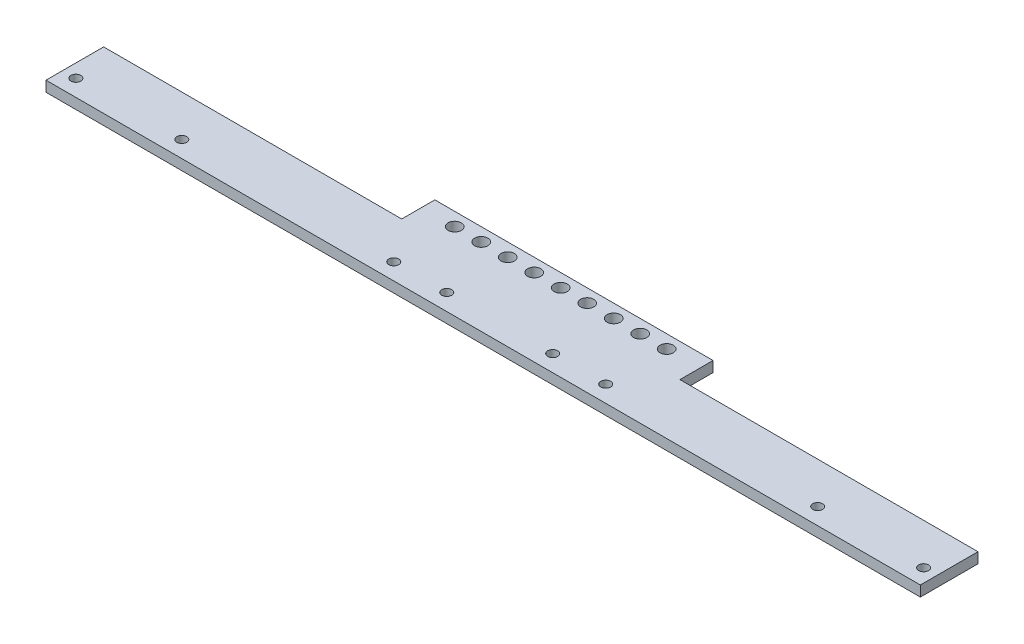
ISO-10303-21;
HEADER;
FILE_DESCRIPTION(('STEP AP214'),'2;1');
FILE_NAME('part.step','',(''),(''),'','','');
FILE_SCHEMA(('AUTOMOTIVE_DESIGN { 1 0 10303 214 1 1 1 1 }'));
ENDSEC;
DATA;
#1=APPLICATION_CONTEXT('core data for automotive mechanical design processes');
#2=APPLICATION_PROTOCOL_DEFINITION('international standard','automotive_design',2000,#1);
#3=PRODUCT_CONTEXT('',#1,'mechanical');
#4=PRODUCT('Part','Part','',(#3));
#5=PRODUCT_RELATED_PRODUCT_CATEGORY('part','',(#4));
#6=PRODUCT_DEFINITION_FORMATION('','',#4);
#7=PRODUCT_DEFINITION_CONTEXT('part definition',#1,'design');
#8=PRODUCT_DEFINITION('design','',#6,#7);
#9=PRODUCT_DEFINITION_SHAPE('','',#8);
#10=(LENGTH_UNIT() NAMED_UNIT(*) SI_UNIT(.MILLI.,.METRE.));
#11=(NAMED_UNIT(*) PLANE_ANGLE_UNIT() SI_UNIT($,.RADIAN.));
#12=(NAMED_UNIT(*) SI_UNIT($,.STERADIAN.) SOLID_ANGLE_UNIT());
#13=UNCERTAINTY_MEASURE_WITH_UNIT(LENGTH_MEASURE(1.E-05),#10,'distance_accuracy_value','');
#14=(GEOMETRIC_REPRESENTATION_CONTEXT(3) GLOBAL_UNCERTAINTY_ASSIGNED_CONTEXT((#13)) GLOBAL_UNIT_ASSIGNED_CONTEXT((#10,
#11,#12)) REPRESENTATION_CONTEXT('',''));
#15=CARTESIAN_POINT('',(0.,0.,0.));
#16=DIRECTION('',(0.,0.,1.));
#17=DIRECTION('',(1.,0.,0.));
#18=AXIS2_PLACEMENT_3D('',#15,#16,#17);
#19=CARTESIAN_POINT('',(264.,3.175,0.));
#20=DIRECTION('',(-1.,0.,0.));
#21=DIRECTION('',(0.,0.,1.));
#22=AXIS2_PLACEMENT_3D('',#19,#20,#21);
#23=PLANE('',#22);
#24=DIRECTION('',(0.,1.,0.));
#25=VECTOR('',#24,1.);
#26=CARTESIAN_POINT('',(264.,-6.825,-15.5356341426765));
#27=LINE('',#26,#25);
#28=CARTESIAN_POINT('',(264.,0.,-15.5356341426765));
#29=VERTEX_POINT('',#28);
#30=CARTESIAN_POINT('',(264.,3.175,-15.5356341426765));
#31=VERTEX_POINT('',#30);
#32=EDGE_CURVE('E156',#29,#31,#27,.T.);
#33=ORIENTED_EDGE('',*,*,#32,.T.);
#34=DIRECTION('',(0.,0.,-1.));
#35=VECTOR('',#34,1.);
#36=CARTESIAN_POINT('',(264.,3.175,0.));
#37=LINE('',#36,#35);
#38=CARTESIAN_POINT('',(264.,3.175,1.86996477732341));
#39=VERTEX_POINT('',#38);
#40=EDGE_CURVE('E170',#39,#31,#37,.T.);
#41=ORIENTED_EDGE('',*,*,#40,.F.);
#42=DIRECTION('',(0.,-1.,0.));
#43=VECTOR('',#42,1.);
#44=CARTESIAN_POINT('',(264.,3.175,1.86996477732341));
#45=LINE('',#44,#43);
#46=CARTESIAN_POINT('',(264.,0.,1.86996477732341));
#47=VERTEX_POINT('',#46);
#48=EDGE_CURVE('E12',#39,#47,#45,.T.);
#49=ORIENTED_EDGE('',*,*,#48,.T.);
#50=DIRECTION('',(0.,0.,-1.));
#51=VECTOR('',#50,1.);
#52=CARTESIAN_POINT('',(264.,0.,0.));
#53=LINE('',#52,#51);
#54=EDGE_CURVE('E203',#47,#29,#53,.T.);
#55=ORIENTED_EDGE('',*,*,#54,.T.);
#56=EDGE_LOOP('',(#33,#41,#49,#55));
#57=FACE_BOUND('',#56,.T.);
#58=ADVANCED_FACE('F80',(#57),#23,.F.);
#59=CARTESIAN_POINT('',(0.,3.175,-25.5356341426765));
#60=DIRECTION('',(0.,0.,-1.));
#61=DIRECTION('',(-1.,0.,0.));
#62=AXIS2_PLACEMENT_3D('',#59,#60,#61);
#63=PLANE('',#62);
#64=DIRECTION('',(1.,0.,0.));
#65=VECTOR('',#64,1.);
#66=CARTESIAN_POINT('',(0.,0.,-25.5356341426765));
#67=LINE('',#66,#65);
#68=CARTESIAN_POINT('',(90.,0.,-25.5356341426765));
#69=VERTEX_POINT('',#68);
#70=CARTESIAN_POINT('',(174.,0.,-25.5356341426765));
#71=VERTEX_POINT('',#70);
#72=EDGE_CURVE('E164',#69,#71,#67,.T.);
#73=ORIENTED_EDGE('',*,*,#72,.F.);
#74=DIRECTION('',(0.,1.,0.));
#75=VECTOR('',#74,1.);
#76=CARTESIAN_POINT('',(90.,-6.825,-25.5356341426765));
#77=LINE('',#76,#75);
#78=CARTESIAN_POINT('',(90.,3.175,-25.5356341426765));
#79=VERTEX_POINT('',#78);
#80=EDGE_CURVE('E149',#69,#79,#77,.T.);
#81=ORIENTED_EDGE('',*,*,#80,.T.);
#82=DIRECTION('',(1.,0.,0.));
#83=VECTOR('',#82,1.);
#84=CARTESIAN_POINT('',(0.,3.175,-25.5356341426765));
#85=LINE('',#84,#83);
#86=CARTESIAN_POINT('',(174.,3.175,-25.5356341426765));
#87=VERTEX_POINT('',#86);
#88=EDGE_CURVE('E162',#79,#87,#85,.T.);
#89=ORIENTED_EDGE('',*,*,#88,.T.);
#90=DIRECTION('',(0.,1.,0.));
#91=VECTOR('',#90,1.);
#92=CARTESIAN_POINT('',(174.,-6.825,-25.5356341426765));
#93=LINE('',#92,#91);
#94=EDGE_CURVE('E103',#71,#87,#93,.T.);
#95=ORIENTED_EDGE('',*,*,#94,.F.);
#96=EDGE_LOOP('',(#73,#81,#89,#95));
#97=FACE_BOUND('',#96,.T.);
#98=ADVANCED_FACE('F161',(#97),#63,.T.);
#99=CARTESIAN_POINT('',(0.,0.,0.));
#100=DIRECTION('',(0.,1.,0.));
#101=DIRECTION('',(0.,0.,1.));
#102=AXIS2_PLACEMENT_3D('',#99,#100,#101);
#103=PLANE('',#102);
#104=CARTESIAN_POINT('',(108.,0.,-21.5356341426765));
#105=DIRECTION('',(0.,1.,0.));
#106=DIRECTION('',(0.,0.,1.));
#107=AXIS2_PLACEMENT_3D('',#104,#105,#106);
#108=CIRCLE('',#107,2.);
#109=CARTESIAN_POINT('',(108.,0.,-19.5356341426765));
#110=VERTEX_POINT('',#109);
#111=EDGE_CURVE('E285',#110,#110,#108,.T.);
#112=ORIENTED_EDGE('',*,*,#111,.T.);
#113=EDGE_LOOP('',(#112));
#114=FACE_BOUND('',#113,.T.);
#115=CARTESIAN_POINT('',(116.,0.,-21.5356341426765));
#116=DIRECTION('',(0.,1.,0.));
#117=DIRECTION('',(0.,0.,1.));
#118=AXIS2_PLACEMENT_3D('',#115,#116,#117);
#119=CIRCLE('',#118,2.);
#120=CARTESIAN_POINT('',(116.,0.,-19.5356341426765));
#121=VERTEX_POINT('',#120);
#122=EDGE_CURVE('E292',#121,#121,#119,.T.);
#123=ORIENTED_EDGE('',*,*,#122,.T.);
#124=EDGE_LOOP('',(#123));
#125=FACE_BOUND('',#124,.T.);
#126=CARTESIAN_POINT('',(124.,0.,-21.5356341426765));
#127=DIRECTION('',(0.,1.,0.));
#128=DIRECTION('',(0.,0.,1.));
#129=AXIS2_PLACEMENT_3D('',#126,#127,#128);
#130=CIRCLE('',#129,2.);
#131=CARTESIAN_POINT('',(124.,0.,-19.5356341426765));
#132=VERTEX_POINT('',#131);
#133=EDGE_CURVE('E295',#132,#132,#130,.T.);
#134=ORIENTED_EDGE('',*,*,#133,.T.);
#135=EDGE_LOOP('',(#134));
#136=FACE_BOUND('',#135,.T.);
#137=CARTESIAN_POINT('',(140.,0.,-21.5356341426765));
#138=DIRECTION('',(0.,1.,0.));
#139=DIRECTION('',(0.,0.,1.));
#140=AXIS2_PLACEMENT_3D('',#137,#138,#139);
#141=CIRCLE('',#140,2.);
#142=CARTESIAN_POINT('',(140.,0.,-19.5356341426765));
#143=VERTEX_POINT('',#142);
#144=EDGE_CURVE('E298',#143,#143,#141,.T.);
#145=ORIENTED_EDGE('',*,*,#144,.T.);
#146=EDGE_LOOP('',(#145));
#147=FACE_BOUND('',#146,.T.);
#148=CARTESIAN_POINT('',(148.,0.,-21.5356341426765));
#149=DIRECTION('',(0.,1.,0.));
#150=DIRECTION('',(0.,0.,1.));
#151=AXIS2_PLACEMENT_3D('',#148,#149,#150);
#152=CIRCLE('',#151,2.);
#153=CARTESIAN_POINT('',(148.,0.,-19.5356341426765));
#154=VERTEX_POINT('',#153);
#155=EDGE_CURVE('E301',#154,#154,#152,.T.);
#156=ORIENTED_EDGE('',*,*,#155,.T.);
#157=EDGE_LOOP('',(#156));
#158=FACE_BOUND('',#157,.T.);
#159=CARTESIAN_POINT('',(156.,0.,-21.5356341426765));
#160=DIRECTION('',(0.,1.,0.));
#161=DIRECTION('',(0.,0.,1.));
#162=AXIS2_PLACEMENT_3D('',#159,#160,#161);
#163=CIRCLE('',#162,2.);
#164=CARTESIAN_POINT('',(156.,0.,-19.5356341426765));
#165=VERTEX_POINT('',#164);
#166=EDGE_CURVE('E304',#165,#165,#163,.T.);
#167=ORIENTED_EDGE('',*,*,#166,.T.);
#168=EDGE_LOOP('',(#167));
#169=FACE_BOUND('',#168,.T.);
#170=CARTESIAN_POINT('',(100.,0.,-3.13003522267659));
#171=DIRECTION('',(0.,1.,0.));
#172=DIRECTION('',(0.,0.,1.));
#173=AXIS2_PLACEMENT_3D('',#170,#171,#172);
#174=CIRCLE('',#173,1.5);
#175=CARTESIAN_POINT('',(100.,0.,-1.63003522267659));
#176=VERTEX_POINT('',#175);
#177=EDGE_CURVE('E194',#176,#176,#174,.T.);
#178=ORIENTED_EDGE('',*,*,#177,.T.);
#179=EDGE_LOOP('',(#178));
#180=FACE_BOUND('',#179,.T.);
#181=CARTESIAN_POINT('',(116.,0.,-3.13003522267659));
#182=DIRECTION('',(0.,1.,0.));
#183=DIRECTION('',(0.,0.,1.));
#184=AXIS2_PLACEMENT_3D('',#181,#182,#183);
#185=CIRCLE('',#184,1.5);
#186=CARTESIAN_POINT('',(116.,0.,-1.63003522267659));
#187=VERTEX_POINT('',#186);
#188=EDGE_CURVE('E251',#187,#187,#185,.T.);
#189=ORIENTED_EDGE('',*,*,#188,.T.);
#190=EDGE_LOOP('',(#189));
#191=FACE_BOUND('',#190,.T.);
#192=CARTESIAN_POINT('',(148.,0.,-3.13003522267659));
#193=DIRECTION('',(0.,1.,0.));
#194=DIRECTION('',(0.,0.,1.));
#195=AXIS2_PLACEMENT_3D('',#192,#193,#194);
#196=CIRCLE('',#195,1.5);
#197=CARTESIAN_POINT('',(148.,0.,-1.63003522267659));
#198=VERTEX_POINT('',#197);
#199=EDGE_CURVE('E254',#198,#198,#196,.T.);
#200=ORIENTED_EDGE('',*,*,#199,.T.);
#201=EDGE_LOOP('',(#200));
#202=FACE_BOUND('',#201,.T.);
#203=CARTESIAN_POINT('',(164.,0.,-3.13003522267659));
#204=DIRECTION('',(0.,1.,0.));
#205=DIRECTION('',(0.,0.,1.));
#206=AXIS2_PLACEMENT_3D('',#203,#204,#205);
#207=CIRCLE('',#206,1.5);
#208=CARTESIAN_POINT('',(164.,0.,-1.63003522267659));
#209=VERTEX_POINT('',#208);
#210=EDGE_CURVE('E257',#209,#209,#207,.T.);
#211=ORIENTED_EDGE('',*,*,#210,.T.);
#212=EDGE_LOOP('',(#211));
#213=FACE_BOUND('',#212,.T.);
#214=CARTESIAN_POINT('',(132.,0.,-21.5356341426765));
#215=DIRECTION('',(0.,1.,0.));
#216=DIRECTION('',(0.,0.,1.));
#217=AXIS2_PLACEMENT_3D('',#214,#215,#216);
#218=CIRCLE('',#217,2.);
#219=CARTESIAN_POINT('',(132.,0.,-19.5356341426765));
#220=VERTEX_POINT('',#219);
#221=EDGE_CURVE('E190',#220,#220,#218,.T.);
#222=ORIENTED_EDGE('',*,*,#221,.T.);
#223=EDGE_LOOP('',(#222));
#224=FACE_BOUND('',#223,.T.);
#225=CARTESIAN_POINT('',(100.,0.,-21.5356341426765));
#226=DIRECTION('',(0.,1.,0.));
#227=DIRECTION('',(0.,0.,1.));
#228=AXIS2_PLACEMENT_3D('',#225,#226,#227);
#229=CIRCLE('',#228,2.);
#230=CARTESIAN_POINT('',(100.,0.,-19.5356341426765));
#231=VERTEX_POINT('',#230);
#232=EDGE_CURVE('E193',#231,#231,#229,.F.);
#233=ORIENTED_EDGE('',*,*,#232,.F.);
#234=EDGE_LOOP('',(#233));
#235=FACE_BOUND('',#234,.T.);
#236=CARTESIAN_POINT('',(164.,0.,-21.5356341426765));
#237=DIRECTION('',(0.,1.,0.));
#238=DIRECTION('',(0.,0.,1.));
#239=AXIS2_PLACEMENT_3D('',#236,#237,#238);
#240=CIRCLE('',#239,2.);
#241=CARTESIAN_POINT('',(164.,0.,-19.5356341426765));
#242=VERTEX_POINT('',#241);
#243=EDGE_CURVE('E197',#242,#242,#240,.T.);
#244=ORIENTED_EDGE('',*,*,#243,.T.);
#245=EDGE_LOOP('',(#244));
#246=FACE_BOUND('',#245,.T.);
#247=CARTESIAN_POINT('',(36.,0.,-3.13003522267659));
#248=DIRECTION('',(0.,1.,0.));
#249=DIRECTION('',(0.,0.,1.));
#250=AXIS2_PLACEMENT_3D('',#247,#248,#249);
#251=CIRCLE('',#250,1.5);
#252=CARTESIAN_POINT('',(36.,0.,-1.63003522267659));
#253=VERTEX_POINT('',#252);
#254=EDGE_CURVE('E209',#253,#253,#251,.T.);
#255=ORIENTED_EDGE('',*,*,#254,.T.);
#256=EDGE_LOOP('',(#255));
#257=FACE_BOUND('',#256,.T.);
#258=CARTESIAN_POINT('',(260.,0.,-3.13003522267659));
#259=DIRECTION('',(0.,1.,0.));
#260=DIRECTION('',(0.,0.,1.));
#261=AXIS2_PLACEMENT_3D('',#258,#259,#260);
#262=CIRCLE('',#261,1.50000000000002);
#263=CARTESIAN_POINT('',(260.,0.,-1.63003522267657));
#264=VERTEX_POINT('',#263);
#265=EDGE_CURVE('E212',#264,#264,#262,.T.);
#266=ORIENTED_EDGE('',*,*,#265,.T.);
#267=EDGE_LOOP('',(#266));
#268=FACE_BOUND('',#267,.T.);
#269=CARTESIAN_POINT('',(228.,0.,-3.13003522267659));
#270=DIRECTION('',(0.,1.,0.));
#271=DIRECTION('',(0.,0.,1.));
#272=AXIS2_PLACEMENT_3D('',#269,#270,#271);
#273=CIRCLE('',#272,1.5);
#274=CARTESIAN_POINT('',(228.,0.,-1.63003522267659));
#275=VERTEX_POINT('',#274);
#276=EDGE_CURVE('E215',#275,#275,#273,.T.);
#277=ORIENTED_EDGE('',*,*,#276,.T.);
#278=EDGE_LOOP('',(#277));
#279=FACE_BOUND('',#278,.T.);
#280=CARTESIAN_POINT('',(4.,0.,-3.13003522267659));
#281=DIRECTION('',(0.,1.,0.));
#282=DIRECTION('',(0.,0.,1.));
#283=AXIS2_PLACEMENT_3D('',#280,#281,#282);
#284=CIRCLE('',#283,1.50000000000002);
#285=CARTESIAN_POINT('',(4.,0.,-1.63003522267657));
#286=VERTEX_POINT('',#285);
#287=EDGE_CURVE('E218',#286,#286,#284,.F.);
#288=ORIENTED_EDGE('',*,*,#287,.F.);
#289=EDGE_LOOP('',(#288));
#290=FACE_BOUND('',#289,.T.);
#291=DIRECTION('',(0.,0.,1.));
#292=VECTOR('',#291,1.);
#293=CARTESIAN_POINT('',(90.,0.,0.));
#294=LINE('',#293,#292);
#295=CARTESIAN_POINT('',(90.,0.,-15.5356341426766));
#296=VERTEX_POINT('',#295);
#297=EDGE_CURVE('E265',#69,#296,#294,.T.);
#298=ORIENTED_EDGE('',*,*,#297,.F.);
#299=ORIENTED_EDGE('',*,*,#72,.T.);
#300=DIRECTION('',(0.,0.,1.));
#301=VECTOR('',#300,1.);
#302=CARTESIAN_POINT('',(174.,0.,0.));
#303=LINE('',#302,#301);
#304=CARTESIAN_POINT('',(174.,0.,-15.5356341426765));
#305=VERTEX_POINT('',#304);
#306=EDGE_CURVE('E277',#71,#305,#303,.T.);
#307=ORIENTED_EDGE('',*,*,#306,.T.);
#308=DIRECTION('',(-1.,0.,0.));
#309=VECTOR('',#308,1.);
#310=CARTESIAN_POINT('',(0.,0.,-15.5356341426765));
#311=LINE('',#310,#309);
#312=EDGE_CURVE('E237',#29,#305,#311,.T.);
#313=ORIENTED_EDGE('',*,*,#312,.F.);
#314=ORIENTED_EDGE('',*,*,#54,.F.);
#315=DIRECTION('',(1.,0.,0.));
#316=VECTOR('',#315,1.);
#317=CARTESIAN_POINT('',(0.,0.,1.86996477732346));
#318=LINE('',#317,#316);
#319=CARTESIAN_POINT('',(0.,0.,1.86996477732346));
#320=VERTEX_POINT('',#319);
#321=EDGE_CURVE('E200',#320,#47,#318,.T.);
#322=ORIENTED_EDGE('',*,*,#321,.F.);
#323=DIRECTION('',(0.,0.,1.));
#324=VECTOR('',#323,1.);
#325=CARTESIAN_POINT('',(0.,0.,0.));
#326=LINE('',#325,#324);
#327=CARTESIAN_POINT('',(0.,0.,-15.5356341426765));
#328=VERTEX_POINT('',#327);
#329=EDGE_CURVE('E207',#328,#320,#326,.T.);
#330=ORIENTED_EDGE('',*,*,#329,.F.);
#331=DIRECTION('',(1.,0.,0.));
#332=VECTOR('',#331,1.);
#333=CARTESIAN_POINT('',(0.,0.,-15.5356341426765));
#334=LINE('',#333,#332);
#335=EDGE_CURVE('E274',#328,#296,#334,.T.);
#336=ORIENTED_EDGE('',*,*,#335,.T.);
#337=EDGE_LOOP('',(#298,#299,#307,#313,#314,#322,#330,#336));
#338=FACE_BOUND('',#337,.T.);
#339=ADVANCED_FACE('F233',(#114,#125,#136,#147,#158,#169,#180,#191,#202,#213,#224,#235,#246,
#257,#268,#279,#290,#338),#103,.F.);
#340=CARTESIAN_POINT('',(0.,3.175,0.));
#341=DIRECTION('',(0.,1.,0.));
#342=DIRECTION('',(0.,0.,1.));
#343=AXIS2_PLACEMENT_3D('',#340,#341,#342);
#344=PLANE('',#343);
#345=CARTESIAN_POINT('',(108.,3.175,-21.5356341426765));
#346=DIRECTION('',(0.,1.,0.));
#347=DIRECTION('',(0.,0.,1.));
#348=AXIS2_PLACEMENT_3D('',#345,#346,#347);
#349=CIRCLE('',#348,2.);
#350=CARTESIAN_POINT('',(108.,3.175,-19.5356341426765));
#351=VERTEX_POINT('',#350);
#352=EDGE_CURVE('E307',#351,#351,#349,.T.);
#353=ORIENTED_EDGE('',*,*,#352,.F.);
#354=EDGE_LOOP('',(#353));
#355=FACE_BOUND('',#354,.T.);
#356=CARTESIAN_POINT('',(116.,3.175,-21.5356341426765));
#357=DIRECTION('',(0.,1.,0.));
#358=DIRECTION('',(0.,0.,1.));
#359=AXIS2_PLACEMENT_3D('',#356,#357,#358);
#360=CIRCLE('',#359,2.);
#361=CARTESIAN_POINT('',(116.,3.175,-19.5356341426765));
#362=VERTEX_POINT('',#361);
#363=EDGE_CURVE('E320',#362,#362,#360,.T.);
#364=ORIENTED_EDGE('',*,*,#363,.F.);
#365=EDGE_LOOP('',(#364));
#366=FACE_BOUND('',#365,.T.);
#367=CARTESIAN_POINT('',(124.,3.175,-21.5356341426765));
#368=DIRECTION('',(0.,1.,0.));
#369=DIRECTION('',(0.,0.,1.));
#370=AXIS2_PLACEMENT_3D('',#367,#368,#369);
#371=CIRCLE('',#370,2.);
#372=CARTESIAN_POINT('',(124.,3.175,-19.5356341426765));
#373=VERTEX_POINT('',#372);
#374=EDGE_CURVE('E317',#373,#373,#371,.T.);
#375=ORIENTED_EDGE('',*,*,#374,.F.);
#376=EDGE_LOOP('',(#375));
#377=FACE_BOUND('',#376,.T.);
#378=CARTESIAN_POINT('',(140.,3.175,-21.5356341426765));
#379=DIRECTION('',(0.,1.,0.));
#380=DIRECTION('',(0.,0.,1.));
#381=AXIS2_PLACEMENT_3D('',#378,#379,#380);
#382=CIRCLE('',#381,2.);
#383=CARTESIAN_POINT('',(140.,3.175,-19.5356341426765));
#384=VERTEX_POINT('',#383);
#385=EDGE_CURVE('E314',#384,#384,#382,.T.);
#386=ORIENTED_EDGE('',*,*,#385,.F.);
#387=EDGE_LOOP('',(#386));
#388=FACE_BOUND('',#387,.T.);
#389=CARTESIAN_POINT('',(148.,3.175,-21.5356341426765));
#390=DIRECTION('',(0.,1.,0.));
#391=DIRECTION('',(0.,0.,1.));
#392=AXIS2_PLACEMENT_3D('',#389,#390,#391);
#393=CIRCLE('',#392,2.);
#394=CARTESIAN_POINT('',(148.,3.175,-19.5356341426765));
#395=VERTEX_POINT('',#394);
#396=EDGE_CURVE('E311',#395,#395,#393,.T.);
#397=ORIENTED_EDGE('',*,*,#396,.F.);
#398=EDGE_LOOP('',(#397));
#399=FACE_BOUND('',#398,.T.);
#400=CARTESIAN_POINT('',(156.,3.175,-21.5356341426765));
#401=DIRECTION('',(0.,1.,0.));
#402=DIRECTION('',(0.,0.,1.));
#403=AXIS2_PLACEMENT_3D('',#400,#401,#402);
#404=CIRCLE('',#403,2.);
#405=CARTESIAN_POINT('',(156.,3.175,-19.5356341426765));
#406=VERTEX_POINT('',#405);
#407=EDGE_CURVE('E308',#406,#406,#404,.T.);
#408=ORIENTED_EDGE('',*,*,#407,.F.);
#409=EDGE_LOOP('',(#408));
#410=FACE_BOUND('',#409,.T.);
#411=CARTESIAN_POINT('',(100.,3.175,-3.13003522267659));
#412=DIRECTION('',(0.,1.,0.));
#413=DIRECTION('',(0.,0.,1.));
#414=AXIS2_PLACEMENT_3D('',#411,#412,#413);
#415=CIRCLE('',#414,1.5);
#416=CARTESIAN_POINT('',(100.,3.175,-1.63003522267659));
#417=VERTEX_POINT('',#416);
#418=EDGE_CURVE('E260',#417,#417,#415,.T.);
#419=ORIENTED_EDGE('',*,*,#418,.F.);
#420=EDGE_LOOP('',(#419));
#421=FACE_BOUND('',#420,.T.);
#422=CARTESIAN_POINT('',(116.,3.175,-3.13003522267659));
#423=DIRECTION('',(0.,1.,0.));
#424=DIRECTION('',(0.,0.,1.));
#425=AXIS2_PLACEMENT_3D('',#422,#423,#424);
#426=CIRCLE('',#425,1.5);
#427=CARTESIAN_POINT('',(116.,3.175,-1.63003522267659));
#428=VERTEX_POINT('',#427);
#429=EDGE_CURVE('E268',#428,#428,#426,.T.);
#430=ORIENTED_EDGE('',*,*,#429,.F.);
#431=EDGE_LOOP('',(#430));
#432=FACE_BOUND('',#431,.T.);
#433=CARTESIAN_POINT('',(148.,3.175,-3.13003522267659));
#434=DIRECTION('',(0.,1.,0.));
#435=DIRECTION('',(0.,0.,1.));
#436=AXIS2_PLACEMENT_3D('',#433,#434,#435);
#437=CIRCLE('',#436,1.5);
#438=CARTESIAN_POINT('',(148.,3.175,-1.63003522267659));
#439=VERTEX_POINT('',#438);
#440=EDGE_CURVE('E264',#439,#439,#437,.T.);
#441=ORIENTED_EDGE('',*,*,#440,.F.);
#442=EDGE_LOOP('',(#441));
#443=FACE_BOUND('',#442,.T.);
#444=CARTESIAN_POINT('',(164.,3.175,-3.13003522267659));
#445=DIRECTION('',(0.,1.,0.));
#446=DIRECTION('',(0.,0.,1.));
#447=AXIS2_PLACEMENT_3D('',#444,#445,#446);
#448=CIRCLE('',#447,1.5);
#449=CARTESIAN_POINT('',(164.,3.175,-1.63003522267659));
#450=VERTEX_POINT('',#449);
#451=EDGE_CURVE('E261',#450,#450,#448,.T.);
#452=ORIENTED_EDGE('',*,*,#451,.F.);
#453=EDGE_LOOP('',(#452));
#454=FACE_BOUND('',#453,.T.);
#455=CARTESIAN_POINT('',(132.,3.175,-21.5356341426765));
#456=DIRECTION('',(0.,1.,0.));
#457=DIRECTION('',(0.,0.,1.));
#458=AXIS2_PLACEMENT_3D('',#455,#456,#457);
#459=CIRCLE('',#458,2.);
#460=CARTESIAN_POINT('',(132.,3.175,-19.5356341426765));
#461=VERTEX_POINT('',#460);
#462=EDGE_CURVE('E220',#461,#461,#459,.T.);
#463=ORIENTED_EDGE('',*,*,#462,.F.);
#464=EDGE_LOOP('',(#463));
#465=FACE_BOUND('',#464,.T.);
#466=CARTESIAN_POINT('',(100.,3.175,-21.5356341426765));
#467=DIRECTION('',(0.,1.,0.));
#468=DIRECTION('',(0.,0.,1.));
#469=AXIS2_PLACEMENT_3D('',#466,#467,#468);
#470=CIRCLE('',#469,2.);
#471=CARTESIAN_POINT('',(100.,3.175,-19.5356341426765));
#472=VERTEX_POINT('',#471);
#473=EDGE_CURVE('E242',#472,#472,#470,.F.);
#474=ORIENTED_EDGE('',*,*,#473,.T.);
#475=EDGE_LOOP('',(#474));
#476=FACE_BOUND('',#475,.T.);
#477=CARTESIAN_POINT('',(164.,3.175,-21.5356341426765));
#478=DIRECTION('',(0.,1.,0.));
#479=DIRECTION('',(0.,0.,1.));
#480=AXIS2_PLACEMENT_3D('',#477,#478,#479);
#481=CIRCLE('',#480,2.);
#482=CARTESIAN_POINT('',(164.,3.175,-19.5356341426765));
#483=VERTEX_POINT('',#482);
#484=EDGE_CURVE('E240',#483,#483,#481,.T.);
#485=ORIENTED_EDGE('',*,*,#484,.F.);
#486=EDGE_LOOP('',(#485));
#487=FACE_BOUND('',#486,.T.);
#488=CARTESIAN_POINT('',(36.,3.175,-3.13003522267659));
#489=DIRECTION('',(0.,1.,0.));
#490=DIRECTION('',(0.,0.,1.));
#491=AXIS2_PLACEMENT_3D('',#488,#489,#490);
#492=CIRCLE('',#491,1.5);
#493=CARTESIAN_POINT('',(36.,3.175,-1.63003522267659));
#494=VERTEX_POINT('',#493);
#495=EDGE_CURVE('E172',#494,#494,#492,.T.);
#496=ORIENTED_EDGE('',*,*,#495,.F.);
#497=EDGE_LOOP('',(#496));
#498=FACE_BOUND('',#497,.T.);
#499=CARTESIAN_POINT('',(260.,3.175,-3.13003522267659));
#500=DIRECTION('',(0.,1.,0.));
#501=DIRECTION('',(0.,0.,1.));
#502=AXIS2_PLACEMENT_3D('',#499,#500,#501);
#503=CIRCLE('',#502,1.50000000000002);
#504=CARTESIAN_POINT('',(260.,3.175,-1.63003522267657));
#505=VERTEX_POINT('',#504);
#506=EDGE_CURVE('E181',#505,#505,#503,.T.);
#507=ORIENTED_EDGE('',*,*,#506,.F.);
#508=EDGE_LOOP('',(#507));
#509=FACE_BOUND('',#508,.T.);
#510=CARTESIAN_POINT('',(228.,3.175,-3.13003522267659));
#511=DIRECTION('',(0.,1.,0.));
#512=DIRECTION('',(0.,0.,1.));
#513=AXIS2_PLACEMENT_3D('',#510,#511,#512);
#514=CIRCLE('',#513,1.5);
#515=CARTESIAN_POINT('',(228.,3.175,-1.63003522267659));
#516=VERTEX_POINT('',#515);
#517=EDGE_CURVE('E184',#516,#516,#514,.T.);
#518=ORIENTED_EDGE('',*,*,#517,.F.);
#519=EDGE_LOOP('',(#518));
#520=FACE_BOUND('',#519,.T.);
#521=CARTESIAN_POINT('',(4.,3.175,-3.13003522267659));
#522=DIRECTION('',(0.,1.,0.));
#523=DIRECTION('',(0.,0.,1.));
#524=AXIS2_PLACEMENT_3D('',#521,#522,#523);
#525=CIRCLE('',#524,1.50000000000002);
#526=CARTESIAN_POINT('',(4.,3.175,-1.63003522267657));
#527=VERTEX_POINT('',#526);
#528=EDGE_CURVE('E187',#527,#527,#525,.F.);
#529=ORIENTED_EDGE('',*,*,#528,.T.);
#530=EDGE_LOOP('',(#529));
#531=FACE_BOUND('',#530,.T.);
#532=ORIENTED_EDGE('',*,*,#88,.F.);
#533=DIRECTION('',(0.,0.,1.));
#534=VECTOR('',#533,1.);
#535=CARTESIAN_POINT('',(90.,3.175,0.));
#536=LINE('',#535,#534);
#537=CARTESIAN_POINT('',(90.,3.175,-15.5356341426766));
#538=VERTEX_POINT('',#537);
#539=EDGE_CURVE('E146',#79,#538,#536,.T.);
#540=ORIENTED_EDGE('',*,*,#539,.T.);
#541=DIRECTION('',(1.,0.,0.));
#542=VECTOR('',#541,1.);
#543=CARTESIAN_POINT('',(0.,3.175,-15.5356341426765));
#544=LINE('',#543,#542);
#545=CARTESIAN_POINT('',(0.,3.175,-15.5356341426765));
#546=VERTEX_POINT('',#545);
#547=EDGE_CURVE('E155',#546,#538,#544,.T.);
#548=ORIENTED_EDGE('',*,*,#547,.F.);
#549=DIRECTION('',(0.,0.,1.));
#550=VECTOR('',#549,1.);
#551=CARTESIAN_POINT('',(0.,3.175,0.));
#552=LINE('',#551,#550);
#553=CARTESIAN_POINT('',(0.,3.175,1.86996477732346));
#554=VERTEX_POINT('',#553);
#555=EDGE_CURVE('E169',#546,#554,#552,.T.);
#556=ORIENTED_EDGE('',*,*,#555,.T.);
#557=DIRECTION('',(1.,0.,0.));
#558=VECTOR('',#557,1.);
#559=CARTESIAN_POINT('',(0.,3.175,1.86996477732346));
#560=LINE('',#559,#558);
#561=EDGE_CURVE('E175',#554,#39,#560,.T.);
#562=ORIENTED_EDGE('',*,*,#561,.T.);
#563=ORIENTED_EDGE('',*,*,#40,.T.);
#564=DIRECTION('',(-1.,0.,0.));
#565=VECTOR('',#564,1.);
#566=CARTESIAN_POINT('',(0.,3.175,-15.5356341426765));
#567=LINE('',#566,#565);
#568=CARTESIAN_POINT('',(174.,3.175,-15.5356341426765));
#569=VERTEX_POINT('',#568);
#570=EDGE_CURVE('E281',#31,#569,#567,.T.);
#571=ORIENTED_EDGE('',*,*,#570,.T.);
#572=DIRECTION('',(0.,0.,1.));
#573=VECTOR('',#572,1.);
#574=CARTESIAN_POINT('',(174.,3.175,0.));
#575=LINE('',#574,#573);
#576=EDGE_CURVE('E168',#87,#569,#575,.T.);
#577=ORIENTED_EDGE('',*,*,#576,.F.);
#578=EDGE_LOOP('',(#532,#540,#548,#556,#562,#563,#571,#577));
#579=FACE_BOUND('',#578,.T.);
#580=ADVANCED_FACE('F166',(#355,#366,#377,#388,#399,#410,#421,#432,#443,#454,#465,#476,#487,
#498,#509,#520,#531,#579),#344,.T.);
#581=CARTESIAN_POINT('',(4.,3.175,-3.13003522267659));
#582=DIRECTION('',(0.,-1.,0.));
#583=DIRECTION('',(0.,0.,-1.));
#584=AXIS2_PLACEMENT_3D('',#581,#582,#583);
#585=CYLINDRICAL_SURFACE('',#584,1.50000000000002);
#586=ORIENTED_EDGE('',*,*,#528,.F.);
#587=EDGE_LOOP('',(#586));
#588=FACE_BOUND('',#587,.T.);
#589=ORIENTED_EDGE('',*,*,#287,.T.);
#590=EDGE_LOOP('',(#589));
#591=FACE_BOUND('',#590,.T.);
#592=ADVANCED_FACE('F331',(#588,#591),#585,.F.);
#593=CARTESIAN_POINT('',(228.,3.175,-3.13003522267659));
#594=DIRECTION('',(0.,-1.,0.));
#595=DIRECTION('',(0.,0.,-1.));
#596=AXIS2_PLACEMENT_3D('',#593,#594,#595);
#597=CYLINDRICAL_SURFACE('',#596,1.5);
#598=ORIENTED_EDGE('',*,*,#517,.T.);
#599=EDGE_LOOP('',(#598));
#600=FACE_BOUND('',#599,.T.);
#601=ORIENTED_EDGE('',*,*,#276,.F.);
#602=EDGE_LOOP('',(#601));
#603=FACE_BOUND('',#602,.T.);
#604=ADVANCED_FACE('F367',(#600,#603),#597,.F.);
#605=CARTESIAN_POINT('',(260.,3.175,-3.13003522267659));
#606=DIRECTION('',(0.,-1.,0.));
#607=DIRECTION('',(0.,0.,-1.));
#608=AXIS2_PLACEMENT_3D('',#605,#606,#607);
#609=CYLINDRICAL_SURFACE('',#608,1.50000000000002);
#610=ORIENTED_EDGE('',*,*,#506,.T.);
#611=EDGE_LOOP('',(#610));
#612=FACE_BOUND('',#611,.T.);
#613=ORIENTED_EDGE('',*,*,#265,.F.);
#614=EDGE_LOOP('',(#613));
#615=FACE_BOUND('',#614,.T.);
#616=ADVANCED_FACE('F412',(#612,#615),#609,.F.);
#617=CARTESIAN_POINT('',(36.,3.175,-3.13003522267659));
#618=DIRECTION('',(0.,-1.,0.));
#619=DIRECTION('',(0.,0.,-1.));
#620=AXIS2_PLACEMENT_3D('',#617,#618,#619);
#621=CYLINDRICAL_SURFACE('',#620,1.5);
#622=ORIENTED_EDGE('',*,*,#495,.T.);
#623=EDGE_LOOP('',(#622));
#624=FACE_BOUND('',#623,.T.);
#625=ORIENTED_EDGE('',*,*,#254,.F.);
#626=EDGE_LOOP('',(#625));
#627=FACE_BOUND('',#626,.T.);
#628=ADVANCED_FACE('F418',(#624,#627),#621,.F.);
#629=CARTESIAN_POINT('',(0.,3.175,0.));
#630=DIRECTION('',(1.,0.,0.));
#631=DIRECTION('',(0.,0.,-1.));
#632=AXIS2_PLACEMENT_3D('',#629,#630,#631);
#633=PLANE('',#632);
#634=ORIENTED_EDGE('',*,*,#555,.F.);
#635=DIRECTION('',(0.,1.,0.));
#636=VECTOR('',#635,1.);
#637=CARTESIAN_POINT('',(0.,-6.825,-15.5356341426765));
#638=LINE('',#637,#636);
#639=EDGE_CURVE('E95',#328,#546,#638,.T.);
#640=ORIENTED_EDGE('',*,*,#639,.F.);
#641=ORIENTED_EDGE('',*,*,#329,.T.);
#642=DIRECTION('',(0.,-1.,0.));
#643=VECTOR('',#642,1.);
#644=CARTESIAN_POINT('',(0.,3.175,1.86996477732346));
#645=LINE('',#644,#643);
#646=EDGE_CURVE('E88',#554,#320,#645,.T.);
#647=ORIENTED_EDGE('',*,*,#646,.F.);
#648=EDGE_LOOP('',(#634,#640,#641,#647));
#649=FACE_BOUND('',#648,.T.);
#650=ADVANCED_FACE('F388',(#649),#633,.F.);
#651=CARTESIAN_POINT('',(0.,3.175,1.86996477732346));
#652=DIRECTION('',(0.,0.,-1.));
#653=DIRECTION('',(-1.,0.,0.));
#654=AXIS2_PLACEMENT_3D('',#651,#652,#653);
#655=PLANE('',#654);
#656=ORIENTED_EDGE('',*,*,#321,.T.);
#657=ORIENTED_EDGE('',*,*,#48,.F.);
#658=ORIENTED_EDGE('',*,*,#561,.F.);
#659=ORIENTED_EDGE('',*,*,#646,.T.);
#660=EDGE_LOOP('',(#656,#657,#658,#659));
#661=FACE_BOUND('',#660,.T.);
#662=ADVANCED_FACE('F226',(#661),#655,.F.);
#663=CARTESIAN_POINT('',(164.,3.175,-21.5356341426765));
#664=DIRECTION('',(0.,-1.,0.));
#665=DIRECTION('',(0.,0.,-1.));
#666=AXIS2_PLACEMENT_3D('',#663,#664,#665);
#667=CYLINDRICAL_SURFACE('',#666,2.);
#668=ORIENTED_EDGE('',*,*,#484,.T.);
#669=EDGE_LOOP('',(#668));
#670=FACE_BOUND('',#669,.T.);
#671=ORIENTED_EDGE('',*,*,#243,.F.);
#672=EDGE_LOOP('',(#671));
#673=FACE_BOUND('',#672,.T.);
#674=ADVANCED_FACE('F387',(#670,#673),#667,.F.);
#675=CARTESIAN_POINT('',(100.,3.175,-21.5356341426765));
#676=DIRECTION('',(0.,-1.,0.));
#677=DIRECTION('',(0.,0.,-1.));
#678=AXIS2_PLACEMENT_3D('',#675,#676,#677);
#679=CYLINDRICAL_SURFACE('',#678,2.);
#680=ORIENTED_EDGE('',*,*,#473,.F.);
#681=EDGE_LOOP('',(#680));
#682=FACE_BOUND('',#681,.T.);
#683=ORIENTED_EDGE('',*,*,#232,.T.);
#684=EDGE_LOOP('',(#683));
#685=FACE_BOUND('',#684,.T.);
#686=ADVANCED_FACE('F390',(#682,#685),#679,.F.);
#687=CARTESIAN_POINT('',(132.,3.175,-21.5356341426765));
#688=DIRECTION('',(0.,-1.,0.));
#689=DIRECTION('',(0.,0.,-1.));
#690=AXIS2_PLACEMENT_3D('',#687,#688,#689);
#691=CYLINDRICAL_SURFACE('',#690,2.);
#692=ORIENTED_EDGE('',*,*,#462,.T.);
#693=EDGE_LOOP('',(#692));
#694=FACE_BOUND('',#693,.T.);
#695=ORIENTED_EDGE('',*,*,#221,.F.);
#696=EDGE_LOOP('',(#695));
#697=FACE_BOUND('',#696,.T.);
#698=ADVANCED_FACE('F82',(#694,#697),#691,.F.);
#699=CARTESIAN_POINT('',(164.,-6.825,-3.13003522267659));
#700=DIRECTION('',(0.,1.,0.));
#701=DIRECTION('',(0.,0.,1.));
#702=AXIS2_PLACEMENT_3D('',#699,#700,#701);
#703=CYLINDRICAL_SURFACE('',#702,1.5);
#704=ORIENTED_EDGE('',*,*,#451,.T.);
#705=EDGE_LOOP('',(#704));
#706=FACE_BOUND('',#705,.T.);
#707=ORIENTED_EDGE('',*,*,#210,.F.);
#708=EDGE_LOOP('',(#707));
#709=FACE_BOUND('',#708,.T.);
#710=ADVANCED_FACE('F397',(#706,#709),#703,.F.);
#711=CARTESIAN_POINT('',(148.,-6.825,-3.13003522267659));
#712=DIRECTION('',(0.,1.,0.));
#713=DIRECTION('',(0.,0.,1.));
#714=AXIS2_PLACEMENT_3D('',#711,#712,#713);
#715=CYLINDRICAL_SURFACE('',#714,1.5);
#716=ORIENTED_EDGE('',*,*,#440,.T.);
#717=EDGE_LOOP('',(#716));
#718=FACE_BOUND('',#717,.T.);
#719=ORIENTED_EDGE('',*,*,#199,.F.);
#720=EDGE_LOOP('',(#719));
#721=FACE_BOUND('',#720,.T.);
#722=ADVANCED_FACE('F458',(#718,#721),#715,.F.);
#723=CARTESIAN_POINT('',(116.,-6.825,-3.13003522267659));
#724=DIRECTION('',(0.,1.,0.));
#725=DIRECTION('',(0.,0.,1.));
#726=AXIS2_PLACEMENT_3D('',#723,#724,#725);
#727=CYLINDRICAL_SURFACE('',#726,1.5);
#728=ORIENTED_EDGE('',*,*,#429,.T.);
#729=EDGE_LOOP('',(#728));
#730=FACE_BOUND('',#729,.T.);
#731=ORIENTED_EDGE('',*,*,#188,.F.);
#732=EDGE_LOOP('',(#731));
#733=FACE_BOUND('',#732,.T.);
#734=ADVANCED_FACE('F468',(#730,#733),#727,.F.);
#735=CARTESIAN_POINT('',(100.,-6.825,-3.13003522267659));
#736=DIRECTION('',(0.,1.,0.));
#737=DIRECTION('',(0.,0.,1.));
#738=AXIS2_PLACEMENT_3D('',#735,#736,#737);
#739=CYLINDRICAL_SURFACE('',#738,1.5);
#740=ORIENTED_EDGE('',*,*,#418,.T.);
#741=EDGE_LOOP('',(#740));
#742=FACE_BOUND('',#741,.T.);
#743=ORIENTED_EDGE('',*,*,#177,.F.);
#744=EDGE_LOOP('',(#743));
#745=FACE_BOUND('',#744,.T.);
#746=ADVANCED_FACE('F478',(#742,#745),#739,.F.);
#747=CARTESIAN_POINT('',(0.,-6.825,-15.5356341426765));
#748=DIRECTION('',(0.,0.,-1.));
#749=DIRECTION('',(-1.,0.,0.));
#750=AXIS2_PLACEMENT_3D('',#747,#748,#749);
#751=PLANE('',#750);
#752=ORIENTED_EDGE('',*,*,#312,.T.);
#753=DIRECTION('',(0.,1.,0.));
#754=VECTOR('',#753,1.);
#755=CARTESIAN_POINT('',(174.,-6.825,-15.5356341426765));
#756=LINE('',#755,#754);
#757=EDGE_CURVE('E280',#305,#569,#756,.T.);
#758=ORIENTED_EDGE('',*,*,#757,.T.);
#759=ORIENTED_EDGE('',*,*,#570,.F.);
#760=ORIENTED_EDGE('',*,*,#32,.F.);
#761=EDGE_LOOP('',(#752,#758,#759,#760));
#762=FACE_BOUND('',#761,.T.);
#763=ADVANCED_FACE('F487',(#762),#751,.T.);
#764=CARTESIAN_POINT('',(174.,-6.825,0.));
#765=DIRECTION('',(-1.,0.,0.));
#766=DIRECTION('',(0.,0.,1.));
#767=AXIS2_PLACEMENT_3D('',#764,#765,#766);
#768=PLANE('',#767);
#769=ORIENTED_EDGE('',*,*,#94,.T.);
#770=ORIENTED_EDGE('',*,*,#576,.T.);
#771=ORIENTED_EDGE('',*,*,#757,.F.);
#772=ORIENTED_EDGE('',*,*,#306,.F.);
#773=EDGE_LOOP('',(#769,#770,#771,#772));
#774=FACE_BOUND('',#773,.T.);
#775=ADVANCED_FACE('F594',(#774),#768,.F.);
#776=CARTESIAN_POINT('',(90.,-6.825,0.));
#777=DIRECTION('',(-1.,0.,0.));
#778=DIRECTION('',(0.,0.,1.));
#779=AXIS2_PLACEMENT_3D('',#776,#777,#778);
#780=PLANE('',#779);
#781=ORIENTED_EDGE('',*,*,#297,.T.);
#782=DIRECTION('',(0.,1.,0.));
#783=VECTOR('',#782,1.);
#784=CARTESIAN_POINT('',(90.,-6.825,-15.5356341426766));
#785=LINE('',#784,#783);
#786=EDGE_CURVE('E152',#296,#538,#785,.T.);
#787=ORIENTED_EDGE('',*,*,#786,.T.);
#788=ORIENTED_EDGE('',*,*,#539,.F.);
#789=ORIENTED_EDGE('',*,*,#80,.F.);
#790=EDGE_LOOP('',(#781,#787,#788,#789));
#791=FACE_BOUND('',#790,.T.);
#792=ADVANCED_FACE('F148',(#791),#780,.T.);
#793=CARTESIAN_POINT('',(0.,-6.825,-15.5356341426765));
#794=DIRECTION('',(0.,0.,1.));
#795=DIRECTION('',(1.,0.,0.));
#796=AXIS2_PLACEMENT_3D('',#793,#794,#795);
#797=PLANE('',#796);
#798=ORIENTED_EDGE('',*,*,#639,.T.);
#799=ORIENTED_EDGE('',*,*,#547,.T.);
#800=ORIENTED_EDGE('',*,*,#786,.F.);
#801=ORIENTED_EDGE('',*,*,#335,.F.);
#802=EDGE_LOOP('',(#798,#799,#800,#801));
#803=FACE_BOUND('',#802,.T.);
#804=ADVANCED_FACE('F521',(#803),#797,.F.);
#805=CARTESIAN_POINT('',(156.,-6.825,-21.5356341426765));
#806=DIRECTION('',(0.,1.,0.));
#807=DIRECTION('',(0.,0.,1.));
#808=AXIS2_PLACEMENT_3D('',#805,#806,#807);
#809=CYLINDRICAL_SURFACE('',#808,2.);
#810=ORIENTED_EDGE('',*,*,#407,.T.);
#811=EDGE_LOOP('',(#810));
#812=FACE_BOUND('',#811,.T.);
#813=ORIENTED_EDGE('',*,*,#166,.F.);
#814=EDGE_LOOP('',(#813));
#815=FACE_BOUND('',#814,.T.);
#816=ADVANCED_FACE('F533',(#812,#815),#809,.F.);
#817=CARTESIAN_POINT('',(148.,-6.825,-21.5356341426765));
#818=DIRECTION('',(0.,1.,0.));
#819=DIRECTION('',(0.,0.,1.));
#820=AXIS2_PLACEMENT_3D('',#817,#818,#819);
#821=CYLINDRICAL_SURFACE('',#820,2.);
#822=ORIENTED_EDGE('',*,*,#396,.T.);
#823=EDGE_LOOP('',(#822));
#824=FACE_BOUND('',#823,.T.);
#825=ORIENTED_EDGE('',*,*,#155,.F.);
#826=EDGE_LOOP('',(#825));
#827=FACE_BOUND('',#826,.T.);
#828=ADVANCED_FACE('F538',(#824,#827),#821,.F.);
#829=CARTESIAN_POINT('',(140.,-6.825,-21.5356341426765));
#830=DIRECTION('',(0.,1.,0.));
#831=DIRECTION('',(0.,0.,1.));
#832=AXIS2_PLACEMENT_3D('',#829,#830,#831);
#833=CYLINDRICAL_SURFACE('',#832,2.);
#834=ORIENTED_EDGE('',*,*,#385,.T.);
#835=EDGE_LOOP('',(#834));
#836=FACE_BOUND('',#835,.T.);
#837=ORIENTED_EDGE('',*,*,#144,.F.);
#838=EDGE_LOOP('',(#837));
#839=FACE_BOUND('',#838,.T.);
#840=ADVANCED_FACE('F548',(#836,#839),#833,.F.);
#841=CARTESIAN_POINT('',(124.,-6.825,-21.5356341426765));
#842=DIRECTION('',(0.,1.,0.));
#843=DIRECTION('',(0.,0.,1.));
#844=AXIS2_PLACEMENT_3D('',#841,#842,#843);
#845=CYLINDRICAL_SURFACE('',#844,2.);
#846=ORIENTED_EDGE('',*,*,#374,.T.);
#847=EDGE_LOOP('',(#846));
#848=FACE_BOUND('',#847,.T.);
#849=ORIENTED_EDGE('',*,*,#133,.F.);
#850=EDGE_LOOP('',(#849));
#851=FACE_BOUND('',#850,.T.);
#852=ADVANCED_FACE('F558',(#848,#851),#845,.F.);
#853=CARTESIAN_POINT('',(116.,-6.825,-21.5356341426765));
#854=DIRECTION('',(0.,1.,0.));
#855=DIRECTION('',(0.,0.,1.));
#856=AXIS2_PLACEMENT_3D('',#853,#854,#855);
#857=CYLINDRICAL_SURFACE('',#856,2.);
#858=ORIENTED_EDGE('',*,*,#363,.T.);
#859=EDGE_LOOP('',(#858));
#860=FACE_BOUND('',#859,.T.);
#861=ORIENTED_EDGE('',*,*,#122,.F.);
#862=EDGE_LOOP('',(#861));
#863=FACE_BOUND('',#862,.T.);
#864=ADVANCED_FACE('F568',(#860,#863),#857,.F.);
#865=CARTESIAN_POINT('',(108.,-6.825,-21.5356341426765));
#866=DIRECTION('',(0.,1.,0.));
#867=DIRECTION('',(0.,0.,1.));
#868=AXIS2_PLACEMENT_3D('',#865,#866,#867);
#869=CYLINDRICAL_SURFACE('',#868,2.);
#870=ORIENTED_EDGE('',*,*,#352,.T.);
#871=EDGE_LOOP('',(#870));
#872=FACE_BOUND('',#871,.T.);
#873=ORIENTED_EDGE('',*,*,#111,.F.);
#874=EDGE_LOOP('',(#873));
#875=FACE_BOUND('',#874,.T.);
#876=ADVANCED_FACE('F326',(#872,#875),#869,.F.);
#877=CLOSED_SHELL('',(#58,#98,#339,#580,#592,#604,#616,#628,#650,#662,#674,#686,#698,#710,#722,
#734,#746,#763,#775,#792,#804,#816,#828,#840,#852,#864,#876));
#878=MANIFOLD_SOLID_BREP('B2',#877);
#879=ADVANCED_BREP_SHAPE_REPRESENTATION('',(#18,#878),#14);
#880=SHAPE_DEFINITION_REPRESENTATION(#9,#879);
ENDSEC;
END-ISO-10303-21;
